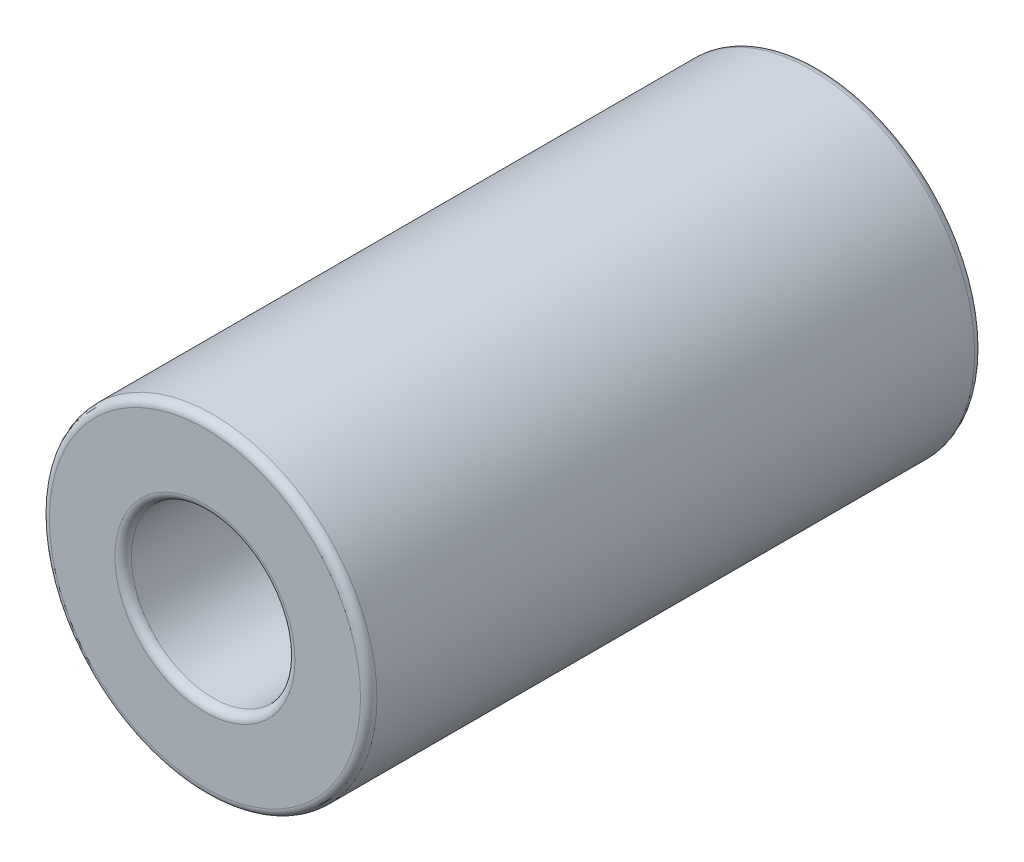
ISO-10303-21;
HEADER;
FILE_DESCRIPTION(('STEP AP214'),'2;1');
FILE_NAME('part.step','',(''),(''),'','','');
FILE_SCHEMA(('AUTOMOTIVE_DESIGN { 1 0 10303 214 1 1 1 1 }'));
ENDSEC;
DATA;
#1=APPLICATION_CONTEXT('core data for automotive mechanical design processes');
#2=APPLICATION_PROTOCOL_DEFINITION('international standard','automotive_design',2000,#1);
#3=PRODUCT_CONTEXT('',#1,'mechanical');
#4=PRODUCT('Part','Part','',(#3));
#5=PRODUCT_RELATED_PRODUCT_CATEGORY('part','',(#4));
#6=PRODUCT_DEFINITION_FORMATION('','',#4);
#7=PRODUCT_DEFINITION_CONTEXT('part definition',#1,'design');
#8=PRODUCT_DEFINITION('design','',#6,#7);
#9=PRODUCT_DEFINITION_SHAPE('','',#8);
#10=(LENGTH_UNIT() NAMED_UNIT(*) SI_UNIT(.MILLI.,.METRE.));
#11=(NAMED_UNIT(*) PLANE_ANGLE_UNIT() SI_UNIT($,.RADIAN.));
#12=(NAMED_UNIT(*) SI_UNIT($,.STERADIAN.) SOLID_ANGLE_UNIT());
#13=UNCERTAINTY_MEASURE_WITH_UNIT(LENGTH_MEASURE(1.E-05),#10,'distance_accuracy_value','');
#14=(GEOMETRIC_REPRESENTATION_CONTEXT(3) GLOBAL_UNCERTAINTY_ASSIGNED_CONTEXT((#13)) GLOBAL_UNIT_ASSIGNED_CONTEXT((#10,
#11,#12)) REPRESENTATION_CONTEXT('',''));
#15=CARTESIAN_POINT('',(0.,0.,0.));
#16=DIRECTION('',(0.,0.,1.));
#17=DIRECTION('',(1.,0.,0.));
#18=AXIS2_PLACEMENT_3D('',#15,#16,#17);
#19=CARTESIAN_POINT('',(0.,0.,-15.));
#20=DIRECTION('',(0.,0.,1.));
#21=DIRECTION('',(1.,0.,0.));
#22=AXIS2_PLACEMENT_3D('',#19,#20,#21);
#23=CYLINDRICAL_SURFACE('',#22,4.);
#24=CARTESIAN_POINT('',(0.,0.,-14.8));
#25=DIRECTION('',(0.,0.,1.));
#26=DIRECTION('',(1.,0.,0.));
#27=AXIS2_PLACEMENT_3D('',#24,#25,#26);
#28=CIRCLE('',#27,4.);
#29=CARTESIAN_POINT('',(4.,0.,-14.8));
#30=VERTEX_POINT('',#29);
#31=EDGE_CURVE('E58',#30,#30,#28,.T.);
#32=ORIENTED_EDGE('',*,*,#31,.T.);
#33=EDGE_LOOP('',(#32));
#34=FACE_BOUND('',#33,.T.);
#35=CARTESIAN_POINT('',(0.,0.,-0.200000000000001));
#36=DIRECTION('',(0.,0.,1.));
#37=DIRECTION('',(1.,0.,0.));
#38=AXIS2_PLACEMENT_3D('',#35,#36,#37);
#39=CIRCLE('',#38,4.);
#40=CARTESIAN_POINT('',(4.,0.,-0.200000000000001));
#41=VERTEX_POINT('',#40);
#42=EDGE_CURVE('E61',#41,#41,#39,.F.);
#43=ORIENTED_EDGE('',*,*,#42,.T.);
#44=EDGE_LOOP('',(#43));
#45=FACE_BOUND('',#44,.T.);
#46=ADVANCED_FACE('F32',(#34,#45),#23,.T.);
#47=CARTESIAN_POINT('',(0.,0.,-15.));
#48=DIRECTION('',(0.,0.,1.));
#49=DIRECTION('',(1.,0.,0.));
#50=AXIS2_PLACEMENT_3D('',#47,#48,#49);
#51=PLANE('',#50);
#52=CARTESIAN_POINT('',(0.,0.,-15.));
#53=DIRECTION('',(0.,0.,1.));
#54=DIRECTION('',(1.,0.,0.));
#55=AXIS2_PLACEMENT_3D('',#52,#53,#54);
#56=CIRCLE('',#55,3.8);
#57=CARTESIAN_POINT('',(3.8,0.,-15.));
#58=VERTEX_POINT('',#57);
#59=EDGE_CURVE('E52',#58,#58,#56,.F.);
#60=ORIENTED_EDGE('',*,*,#59,.T.);
#61=EDGE_LOOP('',(#60));
#62=FACE_BOUND('',#61,.T.);
#63=CARTESIAN_POINT('',(0.,0.,-15.));
#64=DIRECTION('',(0.,0.,1.));
#65=DIRECTION('',(1.,0.,0.));
#66=AXIS2_PLACEMENT_3D('',#63,#64,#65);
#67=CIRCLE('',#66,2.2);
#68=CARTESIAN_POINT('',(2.2,0.,-15.));
#69=VERTEX_POINT('',#68);
#70=EDGE_CURVE('E55',#69,#69,#67,.T.);
#71=ORIENTED_EDGE('',*,*,#70,.T.);
#72=EDGE_LOOP('',(#71));
#73=FACE_BOUND('',#72,.T.);
#74=ADVANCED_FACE('F79',(#62,#73),#51,.F.);
#75=CARTESIAN_POINT('',(0.,0.,0.));
#76=DIRECTION('',(0.,0.,1.));
#77=DIRECTION('',(1.,0.,0.));
#78=AXIS2_PLACEMENT_3D('',#75,#76,#77);
#79=PLANE('',#78);
#80=CARTESIAN_POINT('',(0.,0.,0.));
#81=DIRECTION('',(0.,0.,1.));
#82=DIRECTION('',(1.,0.,0.));
#83=AXIS2_PLACEMENT_3D('',#80,#81,#82);
#84=CIRCLE('',#83,3.8);
#85=CARTESIAN_POINT('',(3.8,0.,0.));
#86=VERTEX_POINT('',#85);
#87=EDGE_CURVE('E10',#86,#86,#84,.T.);
#88=ORIENTED_EDGE('',*,*,#87,.T.);
#89=EDGE_LOOP('',(#88));
#90=FACE_BOUND('',#89,.T.);
#91=CARTESIAN_POINT('',(0.,0.,0.));
#92=DIRECTION('',(0.,0.,1.));
#93=DIRECTION('',(1.,0.,0.));
#94=AXIS2_PLACEMENT_3D('',#91,#92,#93);
#95=CIRCLE('',#94,2.2);
#96=CARTESIAN_POINT('',(2.2,0.,0.));
#97=VERTEX_POINT('',#96);
#98=EDGE_CURVE('E39',#97,#97,#95,.F.);
#99=ORIENTED_EDGE('',*,*,#98,.T.);
#100=EDGE_LOOP('',(#99));
#101=FACE_BOUND('',#100,.T.);
#102=ADVANCED_FACE('F85',(#90,#101),#79,.T.);
#103=CARTESIAN_POINT('',(0.,0.,-15.));
#104=DIRECTION('',(0.,0.,1.));
#105=DIRECTION('',(1.,0.,0.));
#106=AXIS2_PLACEMENT_3D('',#103,#104,#105);
#107=CYLINDRICAL_SURFACE('',#106,2.);
#108=CARTESIAN_POINT('',(0.,0.,-14.8));
#109=DIRECTION('',(0.,0.,1.));
#110=DIRECTION('',(1.,0.,0.));
#111=AXIS2_PLACEMENT_3D('',#108,#109,#110);
#112=CIRCLE('',#111,2.);
#113=CARTESIAN_POINT('',(2.,0.,-14.8));
#114=VERTEX_POINT('',#113);
#115=EDGE_CURVE('E43',#114,#114,#112,.F.);
#116=ORIENTED_EDGE('',*,*,#115,.T.);
#117=EDGE_LOOP('',(#116));
#118=FACE_BOUND('',#117,.T.);
#119=CARTESIAN_POINT('',(0.,0.,-0.200000000000001));
#120=DIRECTION('',(0.,0.,1.));
#121=DIRECTION('',(1.,0.,0.));
#122=AXIS2_PLACEMENT_3D('',#119,#120,#121);
#123=CIRCLE('',#122,2.);
#124=CARTESIAN_POINT('',(2.,0.,-0.200000000000001));
#125=VERTEX_POINT('',#124);
#126=EDGE_CURVE('E47',#125,#125,#123,.T.);
#127=ORIENTED_EDGE('',*,*,#126,.T.);
#128=EDGE_LOOP('',(#127));
#129=FACE_BOUND('',#128,.T.);
#130=ADVANCED_FACE('F91',(#118,#129),#107,.F.);
#131=CARTESIAN_POINT('',(0.,0.,-14.8));
#132=DIRECTION('',(0.,0.,1.));
#133=DIRECTION('',(1.,0.,0.));
#134=AXIS2_PLACEMENT_3D('',#131,#132,#133);
#135=TOROIDAL_SURFACE('',#134,3.8,0.2);
#136=ORIENTED_EDGE('',*,*,#59,.F.);
#137=EDGE_LOOP('',(#136));
#138=FACE_BOUND('',#137,.T.);
#139=ORIENTED_EDGE('',*,*,#31,.F.);
#140=EDGE_LOOP('',(#139));
#141=FACE_BOUND('',#140,.T.);
#142=ADVANCED_FACE('F75',(#138,#141),#135,.T.);
#143=CARTESIAN_POINT('',(0.,0.,-14.8));
#144=DIRECTION('',(0.,0.,1.));
#145=DIRECTION('',(1.,0.,0.));
#146=AXIS2_PLACEMENT_3D('',#143,#144,#145);
#147=TOROIDAL_SURFACE('',#146,2.2,0.2);
#148=ORIENTED_EDGE('',*,*,#115,.F.);
#149=EDGE_LOOP('',(#148));
#150=FACE_BOUND('',#149,.T.);
#151=ORIENTED_EDGE('',*,*,#70,.F.);
#152=EDGE_LOOP('',(#151));
#153=FACE_BOUND('',#152,.T.);
#154=ADVANCED_FACE('F69',(#150,#153),#147,.T.);
#155=CARTESIAN_POINT('',(0.,0.,-0.200000000000001));
#156=DIRECTION('',(0.,0.,1.));
#157=DIRECTION('',(1.,0.,0.));
#158=AXIS2_PLACEMENT_3D('',#155,#156,#157);
#159=TOROIDAL_SURFACE('',#158,3.8,0.2);
#160=ORIENTED_EDGE('',*,*,#42,.F.);
#161=EDGE_LOOP('',(#160));
#162=FACE_BOUND('',#161,.T.);
#163=ORIENTED_EDGE('',*,*,#87,.F.);
#164=EDGE_LOOP('',(#163));
#165=FACE_BOUND('',#164,.T.);
#166=ADVANCED_FACE('F66',(#162,#165),#159,.T.);
#167=CARTESIAN_POINT('',(0.,0.,-0.200000000000001));
#168=DIRECTION('',(0.,0.,1.));
#169=DIRECTION('',(1.,0.,0.));
#170=AXIS2_PLACEMENT_3D('',#167,#168,#169);
#171=TOROIDAL_SURFACE('',#170,2.2,0.2);
#172=ORIENTED_EDGE('',*,*,#98,.F.);
#173=EDGE_LOOP('',(#172));
#174=FACE_BOUND('',#173,.T.);
#175=ORIENTED_EDGE('',*,*,#126,.F.);
#176=EDGE_LOOP('',(#175));
#177=FACE_BOUND('',#176,.T.);
#178=ADVANCED_FACE('F34',(#174,#177),#171,.T.);
#179=CLOSED_SHELL('',(#46,#74,#102,#130,#142,#154,#166,#178));
#180=MANIFOLD_SOLID_BREP('B2',#179);
#181=ADVANCED_BREP_SHAPE_REPRESENTATION('',(#18,#180),#14);
#182=SHAPE_DEFINITION_REPRESENTATION(#9,#181);
ENDSEC;
END-ISO-10303-21;
